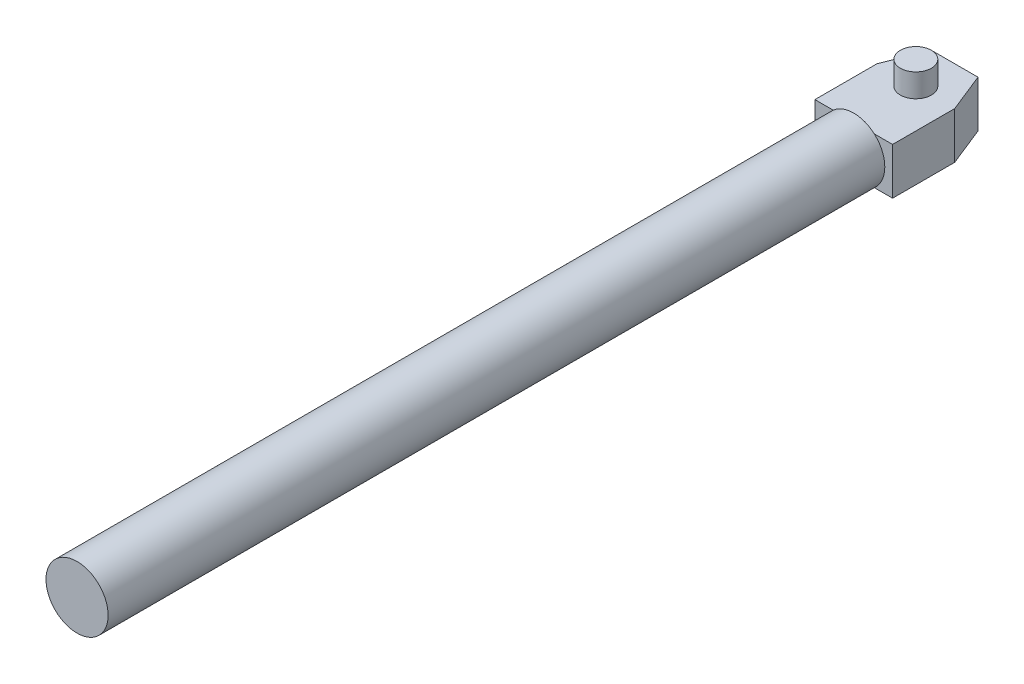
ISO-10303-21;
HEADER;
FILE_DESCRIPTION(('STEP AP214'),'2;1');
FILE_NAME('part.step','',(''),(''),'','','');
FILE_SCHEMA(('AUTOMOTIVE_DESIGN { 1 0 10303 214 1 1 1 1 }'));
ENDSEC;
DATA;
#1=APPLICATION_CONTEXT('core data for automotive mechanical design processes');
#2=APPLICATION_PROTOCOL_DEFINITION('international standard','automotive_design',2000,#1);
#3=PRODUCT_CONTEXT('',#1,'mechanical');
#4=PRODUCT('Part','Part','',(#3));
#5=PRODUCT_RELATED_PRODUCT_CATEGORY('part','',(#4));
#6=PRODUCT_DEFINITION_FORMATION('','',#4);
#7=PRODUCT_DEFINITION_CONTEXT('part definition',#1,'design');
#8=PRODUCT_DEFINITION('design','',#6,#7);
#9=PRODUCT_DEFINITION_SHAPE('','',#8);
#10=(LENGTH_UNIT() NAMED_UNIT(*) SI_UNIT(.MILLI.,.METRE.));
#11=(NAMED_UNIT(*) PLANE_ANGLE_UNIT() SI_UNIT($,.RADIAN.));
#12=(NAMED_UNIT(*) SI_UNIT($,.STERADIAN.) SOLID_ANGLE_UNIT());
#13=UNCERTAINTY_MEASURE_WITH_UNIT(LENGTH_MEASURE(1.E-05),#10,'distance_accuracy_value','');
#14=(GEOMETRIC_REPRESENTATION_CONTEXT(3) GLOBAL_UNCERTAINTY_ASSIGNED_CONTEXT((#13)) GLOBAL_UNIT_ASSIGNED_CONTEXT((#10,
#11,#12)) REPRESENTATION_CONTEXT('',''));
#15=CARTESIAN_POINT('',(0.,0.,0.));
#16=DIRECTION('',(0.,0.,1.));
#17=DIRECTION('',(1.,0.,0.));
#18=AXIS2_PLACEMENT_3D('',#15,#16,#17);
#19=CARTESIAN_POINT('',(0.,0.,0.));
#20=DIRECTION('',(0.,0.,1.));
#21=DIRECTION('',(1.,0.,0.));
#22=AXIS2_PLACEMENT_3D('',#19,#20,#21);
#23=PLANE('',#22);
#24=DIRECTION('',(1.,0.,0.));
#25=VECTOR('',#24,1.);
#26=CARTESIAN_POINT('',(-25.,15.,0.));
#27=LINE('',#26,#25);
#28=CARTESIAN_POINT('',(-13.2287565553229,15.,0.));
#29=VERTEX_POINT('',#28);
#30=CARTESIAN_POINT('',(13.2287565553229,15.,0.));
#31=VERTEX_POINT('',#30);
#32=EDGE_CURVE('E111',#29,#31,#27,.T.);
#33=ORIENTED_EDGE('',*,*,#32,.F.);
#34=CARTESIAN_POINT('',(0.,0.,0.));
#35=DIRECTION('',(0.,0.,1.));
#36=DIRECTION('',(1.,0.,0.));
#37=AXIS2_PLACEMENT_3D('',#34,#35,#36);
#38=CIRCLE('',#37,20.);
#39=EDGE_CURVE('E129',#31,#29,#38,.T.);
#40=ORIENTED_EDGE('',*,*,#39,.F.);
#41=EDGE_LOOP('',(#33,#40));
#42=FACE_BOUND('',#41,.T.);
#43=ADVANCED_FACE('F33',(#42),#23,.F.);
#44=CARTESIAN_POINT('',(0.,0.,500.));
#45=DIRECTION('',(0.,0.,-1.));
#46=DIRECTION('',(-1.,0.,0.));
#47=AXIS2_PLACEMENT_3D('',#44,#45,#46);
#48=CYLINDRICAL_SURFACE('',#47,20.);
#49=CARTESIAN_POINT('',(0.,0.,500.));
#50=DIRECTION('',(0.,0.,1.));
#51=DIRECTION('',(1.,0.,0.));
#52=AXIS2_PLACEMENT_3D('',#49,#50,#51);
#53=CIRCLE('',#52,20.);
#54=CARTESIAN_POINT('',(20.,0.,500.));
#55=VERTEX_POINT('',#54);
#56=EDGE_CURVE('E135',#55,#55,#53,.T.);
#57=ORIENTED_EDGE('',*,*,#56,.F.);
#58=EDGE_LOOP('',(#57));
#59=FACE_BOUND('',#58,.T.);
#60=ORIENTED_EDGE('',*,*,#39,.T.);
#61=CARTESIAN_POINT('',(-13.2287565553229,-15.,0.));
#62=VERTEX_POINT('',#61);
#63=EDGE_CURVE('E105',#29,#62,#38,.T.);
#64=ORIENTED_EDGE('',*,*,#63,.T.);
#65=CARTESIAN_POINT('',(13.2287565553229,-15.,0.));
#66=VERTEX_POINT('',#65);
#67=EDGE_CURVE('E51',#62,#66,#38,.T.);
#68=ORIENTED_EDGE('',*,*,#67,.T.);
#69=EDGE_CURVE('E125',#66,#31,#38,.T.);
#70=ORIENTED_EDGE('',*,*,#69,.T.);
#71=EDGE_LOOP('',(#60,#64,#68,#70));
#72=FACE_BOUND('',#71,.T.);
#73=ADVANCED_FACE('F35',(#59,#72),#48,.T.);
#74=CARTESIAN_POINT('',(0.,0.,500.));
#75=DIRECTION('',(0.,0.,1.));
#76=DIRECTION('',(1.,0.,0.));
#77=AXIS2_PLACEMENT_3D('',#74,#75,#76);
#78=PLANE('',#77);
#79=ORIENTED_EDGE('',*,*,#56,.T.);
#80=EDGE_LOOP('',(#79));
#81=FACE_BOUND('',#80,.T.);
#82=ADVANCED_FACE('F205',(#81),#78,.T.);
#83=ORIENTED_EDGE('',*,*,#67,.F.);
#84=DIRECTION('',(1.,0.,0.));
#85=VECTOR('',#84,1.);
#86=CARTESIAN_POINT('',(-25.,-15.,0.));
#87=LINE('',#86,#85);
#88=EDGE_CURVE('E42',#62,#66,#87,.T.);
#89=ORIENTED_EDGE('',*,*,#88,.T.);
#90=EDGE_LOOP('',(#83,#89));
#91=FACE_BOUND('',#90,.T.);
#92=ADVANCED_FACE('F201',(#91),#23,.F.);
#93=CARTESIAN_POINT('',(-25.,15.,0.));
#94=DIRECTION('',(0.,0.,-1.));
#95=DIRECTION('',(-1.,0.,0.));
#96=AXIS2_PLACEMENT_3D('',#93,#94,#95);
#97=PLANE('',#96);
#98=ORIENTED_EDGE('',*,*,#63,.F.);
#99=CARTESIAN_POINT('',(-25.,15.,0.));
#100=VERTEX_POINT('',#99);
#101=EDGE_CURVE('E98',#100,#29,#27,.T.);
#102=ORIENTED_EDGE('',*,*,#101,.F.);
#103=DIRECTION('',(0.,-1.,0.));
#104=VECTOR('',#103,1.);
#105=CARTESIAN_POINT('',(-25.,15.,0.));
#106=LINE('',#105,#104);
#107=CARTESIAN_POINT('',(-25.,-15.,0.));
#108=VERTEX_POINT('',#107);
#109=EDGE_CURVE('E103',#100,#108,#106,.T.);
#110=ORIENTED_EDGE('',*,*,#109,.T.);
#111=EDGE_CURVE('E151',#108,#62,#87,.T.);
#112=ORIENTED_EDGE('',*,*,#111,.T.);
#113=EDGE_LOOP('',(#98,#102,#110,#112));
#114=FACE_BOUND('',#113,.T.);
#115=ADVANCED_FACE('F100',(#114),#97,.F.);
#116=CARTESIAN_POINT('',(-25.,15.,0.));
#117=DIRECTION('',(1.,0.,0.));
#118=DIRECTION('',(0.,0.,-1.));
#119=AXIS2_PLACEMENT_3D('',#116,#117,#118);
#120=PLANE('',#119);
#121=DIRECTION('',(0.,0.,1.));
#122=VECTOR('',#121,1.);
#123=CARTESIAN_POINT('',(-25.,-15.,0.));
#124=LINE('',#123,#122);
#125=CARTESIAN_POINT('',(-25.,-15.,-40.));
#126=VERTEX_POINT('',#125);
#127=EDGE_CURVE('E124',#126,#108,#124,.T.);
#128=ORIENTED_EDGE('',*,*,#127,.T.);
#129=ORIENTED_EDGE('',*,*,#109,.F.);
#130=DIRECTION('',(0.,0.,1.));
#131=VECTOR('',#130,1.);
#132=CARTESIAN_POINT('',(-25.,15.,0.));
#133=LINE('',#132,#131);
#134=CARTESIAN_POINT('',(-25.,15.,-40.));
#135=VERTEX_POINT('',#134);
#136=EDGE_CURVE('E113',#135,#100,#133,.T.);
#137=ORIENTED_EDGE('',*,*,#136,.F.);
#138=DIRECTION('',(0.,-1.,0.));
#139=VECTOR('',#138,1.);
#140=CARTESIAN_POINT('',(-25.,15.,-40.));
#141=LINE('',#140,#139);
#142=EDGE_CURVE('E167',#135,#126,#141,.T.);
#143=ORIENTED_EDGE('',*,*,#142,.T.);
#144=EDGE_LOOP('',(#128,#129,#137,#143));
#145=FACE_BOUND('',#144,.T.);
#146=ADVANCED_FACE('F122',(#145),#120,.F.);
#147=ORIENTED_EDGE('',*,*,#69,.F.);
#148=CARTESIAN_POINT('',(25.,-15.,0.));
#149=VERTEX_POINT('',#148);
#150=EDGE_CURVE('E145',#66,#149,#87,.T.);
#151=ORIENTED_EDGE('',*,*,#150,.T.);
#152=DIRECTION('',(0.,-1.,0.));
#153=VECTOR('',#152,1.);
#154=CARTESIAN_POINT('',(25.,15.,0.));
#155=LINE('',#154,#153);
#156=CARTESIAN_POINT('',(25.,15.,0.));
#157=VERTEX_POINT('',#156);
#158=EDGE_CURVE('E126',#157,#149,#155,.T.);
#159=ORIENTED_EDGE('',*,*,#158,.F.);
#160=EDGE_CURVE('E109',#31,#157,#27,.T.);
#161=ORIENTED_EDGE('',*,*,#160,.F.);
#162=EDGE_LOOP('',(#147,#151,#159,#161));
#163=FACE_BOUND('',#162,.T.);
#164=ADVANCED_FACE('F143',(#163),#97,.F.);
#165=CARTESIAN_POINT('',(25.,15.,0.));
#166=DIRECTION('',(-1.,0.,0.));
#167=DIRECTION('',(0.,0.,1.));
#168=AXIS2_PLACEMENT_3D('',#165,#166,#167);
#169=PLANE('',#168);
#170=DIRECTION('',(0.,0.,-1.));
#171=VECTOR('',#170,1.);
#172=CARTESIAN_POINT('',(25.,-15.,0.));
#173=LINE('',#172,#171);
#174=CARTESIAN_POINT('',(25.,-15.,-40.));
#175=VERTEX_POINT('',#174);
#176=EDGE_CURVE('E150',#149,#175,#173,.T.);
#177=ORIENTED_EDGE('',*,*,#176,.T.);
#178=DIRECTION('',(0.,-1.,0.));
#179=VECTOR('',#178,1.);
#180=CARTESIAN_POINT('',(25.,15.,-40.));
#181=LINE('',#180,#179);
#182=CARTESIAN_POINT('',(25.,15.,-40.));
#183=VERTEX_POINT('',#182);
#184=EDGE_CURVE('E131',#183,#175,#181,.T.);
#185=ORIENTED_EDGE('',*,*,#184,.F.);
#186=DIRECTION('',(0.,0.,-1.));
#187=VECTOR('',#186,1.);
#188=CARTESIAN_POINT('',(25.,15.,0.));
#189=LINE('',#188,#187);
#190=EDGE_CURVE('E108',#157,#183,#189,.T.);
#191=ORIENTED_EDGE('',*,*,#190,.F.);
#192=ORIENTED_EDGE('',*,*,#158,.T.);
#193=EDGE_LOOP('',(#177,#185,#191,#192));
#194=FACE_BOUND('',#193,.T.);
#195=ADVANCED_FACE('F159',(#194),#169,.F.);
#196=CARTESIAN_POINT('',(15.,15.,-65.));
#197=DIRECTION('',(-0.928476690885259,0.,0.371390676354104));
#198=DIRECTION('',(0.371390676354104,0.,0.928476690885259));
#199=AXIS2_PLACEMENT_3D('',#196,#197,#198);
#200=PLANE('',#199);
#201=DIRECTION('',(-0.371390676354104,0.,-0.928476690885259));
#202=VECTOR('',#201,1.);
#203=CARTESIAN_POINT('',(15.,-15.,-65.));
#204=LINE('',#203,#202);
#205=CARTESIAN_POINT('',(15.,-15.,-65.));
#206=VERTEX_POINT('',#205);
#207=EDGE_CURVE('E180',#175,#206,#204,.T.);
#208=ORIENTED_EDGE('',*,*,#207,.T.);
#209=DIRECTION('',(0.,-1.,0.));
#210=VECTOR('',#209,1.);
#211=CARTESIAN_POINT('',(15.,15.,-65.));
#212=LINE('',#211,#210);
#213=CARTESIAN_POINT('',(15.,15.,-65.));
#214=VERTEX_POINT('',#213);
#215=EDGE_CURVE('E171',#214,#206,#212,.T.);
#216=ORIENTED_EDGE('',*,*,#215,.F.);
#217=DIRECTION('',(-0.371390676354104,0.,-0.928476690885259));
#218=VECTOR('',#217,1.);
#219=CARTESIAN_POINT('',(15.,15.,-65.));
#220=LINE('',#219,#218);
#221=EDGE_CURVE('E162',#183,#214,#220,.T.);
#222=ORIENTED_EDGE('',*,*,#221,.F.);
#223=ORIENTED_EDGE('',*,*,#184,.T.);
#224=EDGE_LOOP('',(#208,#216,#222,#223));
#225=FACE_BOUND('',#224,.T.);
#226=ADVANCED_FACE('F178',(#225),#200,.F.);
#227=CARTESIAN_POINT('',(-15.,15.,-65.));
#228=DIRECTION('',(0.,0.,1.));
#229=DIRECTION('',(1.,0.,0.));
#230=AXIS2_PLACEMENT_3D('',#227,#228,#229);
#231=PLANE('',#230);
#232=DIRECTION('',(-1.,0.,0.));
#233=VECTOR('',#232,1.);
#234=CARTESIAN_POINT('',(-15.,-15.,-65.));
#235=LINE('',#234,#233);
#236=CARTESIAN_POINT('',(-15.,-15.,-65.));
#237=VERTEX_POINT('',#236);
#238=EDGE_CURVE('E183',#206,#237,#235,.T.);
#239=ORIENTED_EDGE('',*,*,#238,.T.);
#240=DIRECTION('',(0.,-1.,0.));
#241=VECTOR('',#240,1.);
#242=CARTESIAN_POINT('',(-15.,15.,-65.));
#243=LINE('',#242,#241);
#244=CARTESIAN_POINT('',(-15.,15.,-65.));
#245=VERTEX_POINT('',#244);
#246=EDGE_CURVE('E168',#245,#237,#243,.T.);
#247=ORIENTED_EDGE('',*,*,#246,.F.);
#248=DIRECTION('',(-1.,0.,0.));
#249=VECTOR('',#248,1.);
#250=CARTESIAN_POINT('',(-15.,15.,-65.));
#251=LINE('',#250,#249);
#252=EDGE_CURVE('E163',#214,#245,#251,.T.);
#253=ORIENTED_EDGE('',*,*,#252,.F.);
#254=ORIENTED_EDGE('',*,*,#215,.T.);
#255=EDGE_LOOP('',(#239,#247,#253,#254));
#256=FACE_BOUND('',#255,.T.);
#257=ADVANCED_FACE('F190',(#256),#231,.F.);
#258=CARTESIAN_POINT('',(-25.,15.,-40.));
#259=DIRECTION('',(0.928476690885259,0.,0.371390676354104));
#260=DIRECTION('',(0.371390676354104,0.,-0.928476690885259));
#261=AXIS2_PLACEMENT_3D('',#258,#259,#260);
#262=PLANE('',#261);
#263=DIRECTION('',(-0.371390676354104,0.,0.928476690885259));
#264=VECTOR('',#263,1.);
#265=CARTESIAN_POINT('',(-25.,-15.,-40.));
#266=LINE('',#265,#264);
#267=EDGE_CURVE('E120',#237,#126,#266,.T.);
#268=ORIENTED_EDGE('',*,*,#267,.T.);
#269=ORIENTED_EDGE('',*,*,#142,.F.);
#270=DIRECTION('',(-0.371390676354104,0.,0.928476690885259));
#271=VECTOR('',#270,1.);
#272=CARTESIAN_POINT('',(-25.,15.,-40.));
#273=LINE('',#272,#271);
#274=EDGE_CURVE('E116',#245,#135,#273,.T.);
#275=ORIENTED_EDGE('',*,*,#274,.F.);
#276=ORIENTED_EDGE('',*,*,#246,.T.);
#277=EDGE_LOOP('',(#268,#269,#275,#276));
#278=FACE_BOUND('',#277,.T.);
#279=ADVANCED_FACE('F188',(#278),#262,.F.);
#280=CARTESIAN_POINT('',(0.,15.,0.));
#281=DIRECTION('',(0.,-1.,0.));
#282=DIRECTION('',(0.,0.,-1.));
#283=AXIS2_PLACEMENT_3D('',#280,#281,#282);
#284=PLANE('',#283);
#285=CARTESIAN_POINT('',(0.,15.,-40.));
#286=DIRECTION('',(0.,-1.,0.));
#287=DIRECTION('',(0.,0.,-1.));
#288=AXIS2_PLACEMENT_3D('',#285,#286,#287);
#289=CIRCLE('',#288,10.);
#290=CARTESIAN_POINT('',(0.,15.,-50.));
#291=VERTEX_POINT('',#290);
#292=EDGE_CURVE('E11',#291,#291,#289,.F.);
#293=ORIENTED_EDGE('',*,*,#292,.F.);
#294=EDGE_LOOP('',(#293));
#295=FACE_BOUND('',#294,.T.);
#296=ORIENTED_EDGE('',*,*,#136,.T.);
#297=ORIENTED_EDGE('',*,*,#101,.T.);
#298=ORIENTED_EDGE('',*,*,#32,.T.);
#299=ORIENTED_EDGE('',*,*,#160,.T.);
#300=ORIENTED_EDGE('',*,*,#190,.T.);
#301=ORIENTED_EDGE('',*,*,#221,.T.);
#302=ORIENTED_EDGE('',*,*,#252,.T.);
#303=ORIENTED_EDGE('',*,*,#274,.T.);
#304=EDGE_LOOP('',(#296,#297,#298,#299,#300,#301,#302,#303));
#305=FACE_BOUND('',#304,.T.);
#306=ADVANCED_FACE('F114',(#295,#305),#284,.F.);
#307=CARTESIAN_POINT('',(0.,-15.,0.));
#308=DIRECTION('',(0.,-1.,0.));
#309=DIRECTION('',(0.,0.,-1.));
#310=AXIS2_PLACEMENT_3D('',#307,#308,#309);
#311=PLANE('',#310);
#312=CARTESIAN_POINT('',(0.,-15.,-40.));
#313=DIRECTION('',(0.,-1.,0.));
#314=DIRECTION('',(0.,0.,-1.));
#315=AXIS2_PLACEMENT_3D('',#312,#313,#314);
#316=CIRCLE('',#315,10.);
#317=CARTESIAN_POINT('',(0.,-15.,-50.));
#318=VERTEX_POINT('',#317);
#319=EDGE_CURVE('E37',#318,#318,#316,.F.);
#320=ORIENTED_EDGE('',*,*,#319,.T.);
#321=EDGE_LOOP('',(#320));
#322=FACE_BOUND('',#321,.T.);
#323=ORIENTED_EDGE('',*,*,#127,.F.);
#324=ORIENTED_EDGE('',*,*,#267,.F.);
#325=ORIENTED_EDGE('',*,*,#238,.F.);
#326=ORIENTED_EDGE('',*,*,#207,.F.);
#327=ORIENTED_EDGE('',*,*,#176,.F.);
#328=ORIENTED_EDGE('',*,*,#150,.F.);
#329=ORIENTED_EDGE('',*,*,#88,.F.);
#330=ORIENTED_EDGE('',*,*,#111,.F.);
#331=EDGE_LOOP('',(#323,#324,#325,#326,#327,#328,#329,#330));
#332=FACE_BOUND('',#331,.T.);
#333=ADVANCED_FACE('F148',(#322,#332),#311,.T.);
#334=CARTESIAN_POINT('',(0.,-30.,-40.));
#335=DIRECTION('',(0.,1.,0.));
#336=DIRECTION('',(0.,0.,1.));
#337=AXIS2_PLACEMENT_3D('',#334,#335,#336);
#338=PLANE('',#337);
#339=CARTESIAN_POINT('',(0.,-30.,-40.));
#340=DIRECTION('',(0.,1.,0.));
#341=DIRECTION('',(0.,0.,1.));
#342=AXIS2_PLACEMENT_3D('',#339,#340,#341);
#343=CIRCLE('',#342,10.);
#344=CARTESIAN_POINT('',(0.,-30.,-30.));
#345=VERTEX_POINT('',#344);
#346=EDGE_CURVE('E304',#345,#345,#343,.T.);
#347=ORIENTED_EDGE('',*,*,#346,.F.);
#348=EDGE_LOOP('',(#347));
#349=FACE_BOUND('',#348,.T.);
#350=ADVANCED_FACE('F258',(#349),#338,.F.);
#351=CARTESIAN_POINT('',(0.,30.,-40.));
#352=DIRECTION('',(0.,-1.,0.));
#353=DIRECTION('',(0.,0.,-1.));
#354=AXIS2_PLACEMENT_3D('',#351,#352,#353);
#355=CYLINDRICAL_SURFACE('',#354,10.);
#356=ORIENTED_EDGE('',*,*,#319,.F.);
#357=EDGE_LOOP('',(#356));
#358=FACE_BOUND('',#357,.T.);
#359=ORIENTED_EDGE('',*,*,#346,.T.);
#360=EDGE_LOOP('',(#359));
#361=FACE_BOUND('',#360,.T.);
#362=ADVANCED_FACE('F268',(#358,#361),#355,.T.);
#363=CARTESIAN_POINT('',(0.,30.,-40.));
#364=DIRECTION('',(0.,1.,0.));
#365=DIRECTION('',(0.,0.,1.));
#366=AXIS2_PLACEMENT_3D('',#363,#364,#365);
#367=CIRCLE('',#366,10.);
#368=CARTESIAN_POINT('',(0.,30.,-30.));
#369=VERTEX_POINT('',#368);
#370=EDGE_CURVE('E303',#369,#369,#367,.T.);
#371=ORIENTED_EDGE('',*,*,#370,.F.);
#372=EDGE_LOOP('',(#371));
#373=FACE_BOUND('',#372,.T.);
#374=ORIENTED_EDGE('',*,*,#292,.T.);
#375=EDGE_LOOP('',(#374));
#376=FACE_BOUND('',#375,.T.);
#377=ADVANCED_FACE('F278',(#373,#376),#355,.T.);
#378=CARTESIAN_POINT('',(0.,30.,-40.));
#379=DIRECTION('',(0.,1.,0.));
#380=DIRECTION('',(0.,0.,1.));
#381=AXIS2_PLACEMENT_3D('',#378,#379,#380);
#382=PLANE('',#381);
#383=ORIENTED_EDGE('',*,*,#370,.T.);
#384=EDGE_LOOP('',(#383));
#385=FACE_BOUND('',#384,.T.);
#386=ADVANCED_FACE('F288',(#385),#382,.T.);
#387=CLOSED_SHELL('',(#43,#73,#82,#92,#115,#146,#164,#195,#226,#257,#279,#306,#333,#350,#362,
#377,#386));
#388=MANIFOLD_SOLID_BREP('B2',#387);
#389=ADVANCED_BREP_SHAPE_REPRESENTATION('',(#18,#388),#14);
#390=SHAPE_DEFINITION_REPRESENTATION(#9,#389);
ENDSEC;
END-ISO-10303-21;
